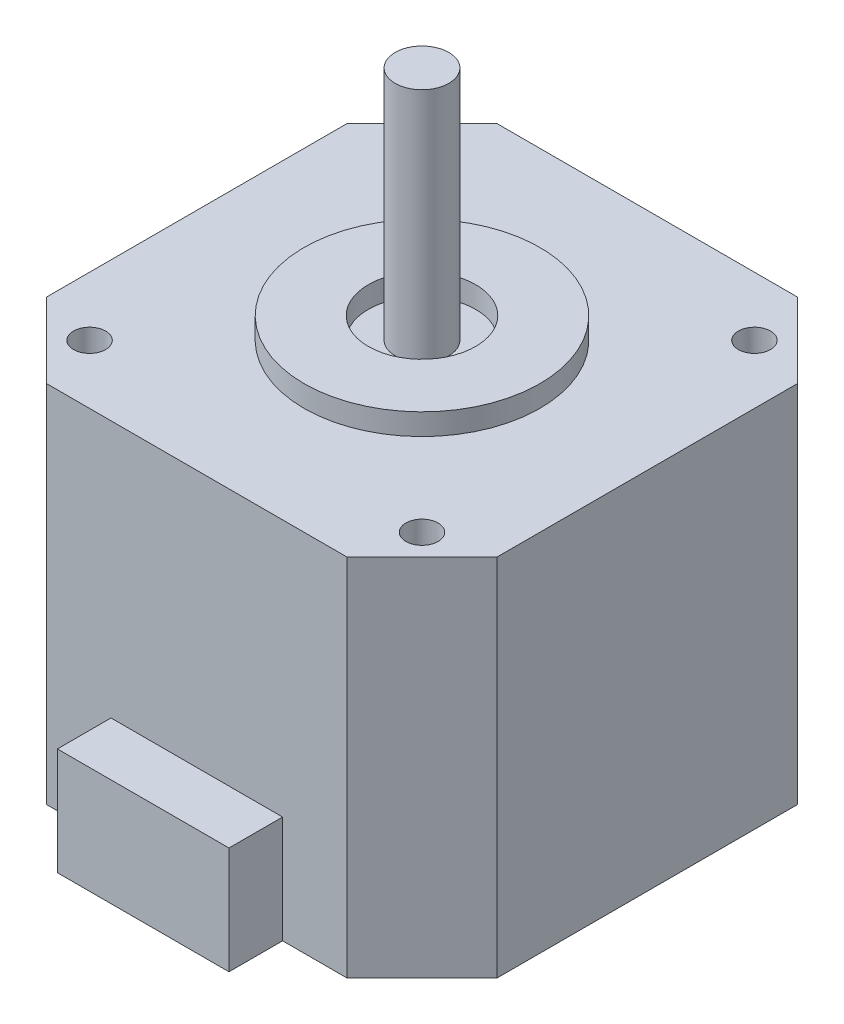
ISO-10303-21;
HEADER;
FILE_DESCRIPTION(('STEP AP214'),'2;1');
FILE_NAME('part.step','',(''),(''),'','','');
FILE_SCHEMA(('AUTOMOTIVE_DESIGN { 1 0 10303 214 1 1 1 1 }'));
ENDSEC;
DATA;
#1=APPLICATION_CONTEXT('core data for automotive mechanical design processes');
#2=APPLICATION_PROTOCOL_DEFINITION('international standard','automotive_design',2000,#1);
#3=PRODUCT_CONTEXT('',#1,'mechanical');
#4=PRODUCT('Part','Part','',(#3));
#5=PRODUCT_RELATED_PRODUCT_CATEGORY('part','',(#4));
#6=PRODUCT_DEFINITION_FORMATION('','',#4);
#7=PRODUCT_DEFINITION_CONTEXT('part definition',#1,'design');
#8=PRODUCT_DEFINITION('design','',#6,#7);
#9=PRODUCT_DEFINITION_SHAPE('','',#8);
#10=(LENGTH_UNIT() NAMED_UNIT(*) SI_UNIT(.MILLI.,.METRE.));
#11=(NAMED_UNIT(*) PLANE_ANGLE_UNIT() SI_UNIT($,.RADIAN.));
#12=(NAMED_UNIT(*) SI_UNIT($,.STERADIAN.) SOLID_ANGLE_UNIT());
#13=UNCERTAINTY_MEASURE_WITH_UNIT(LENGTH_MEASURE(1.E-05),#10,'distance_accuracy_value','');
#14=(GEOMETRIC_REPRESENTATION_CONTEXT(3) GLOBAL_UNCERTAINTY_ASSIGNED_CONTEXT((#13)) GLOBAL_UNIT_ASSIGNED_CONTEXT((#10,
#11,#12)) REPRESENTATION_CONTEXT('',''));
#15=CARTESIAN_POINT('',(0.,0.,0.));
#16=DIRECTION('',(0.,0.,1.));
#17=DIRECTION('',(1.,0.,0.));
#18=AXIS2_PLACEMENT_3D('',#15,#16,#17);
#19=CARTESIAN_POINT('',(0.,34.,0.));
#20=DIRECTION('',(0.,0.,-1.));
#21=DIRECTION('',(-1.,0.,0.));
#22=AXIS2_PLACEMENT_3D('',#19,#20,#21);
#23=PLANE('',#22);
#24=DIRECTION('',(0.,-1.,0.));
#25=VECTOR('',#24,1.);
#26=CARTESIAN_POINT('',(13.,0.,0.));
#27=LINE('',#26,#25);
#28=CARTESIAN_POINT('',(13.,10.,0.));
#29=VERTEX_POINT('',#28);
#30=CARTESIAN_POINT('',(13.,0.,0.));
#31=VERTEX_POINT('',#30);
#32=EDGE_CURVE('E55',#29,#31,#27,.T.);
#33=ORIENTED_EDGE('',*,*,#32,.F.);
#34=DIRECTION('',(-1.,0.,0.));
#35=VECTOR('',#34,1.);
#36=CARTESIAN_POINT('',(13.,10.,0.));
#37=LINE('',#36,#35);
#38=CARTESIAN_POINT('',(29.,10.,0.));
#39=VERTEX_POINT('',#38);
#40=EDGE_CURVE('E149',#39,#29,#37,.T.);
#41=ORIENTED_EDGE('',*,*,#40,.F.);
#42=DIRECTION('',(0.,1.,0.));
#43=VECTOR('',#42,1.);
#44=CARTESIAN_POINT('',(29.,0.,0.));
#45=LINE('',#44,#43);
#46=CARTESIAN_POINT('',(29.,0.,0.));
#47=VERTEX_POINT('',#46);
#48=EDGE_CURVE('E61',#47,#39,#45,.T.);
#49=ORIENTED_EDGE('',*,*,#48,.F.);
#50=DIRECTION('',(1.,0.,0.));
#51=VECTOR('',#50,1.);
#52=CARTESIAN_POINT('',(0.,0.,0.));
#53=LINE('',#52,#51);
#54=CARTESIAN_POINT('',(35.,0.,0.));
#55=VERTEX_POINT('',#54);
#56=EDGE_CURVE('E199',#47,#55,#53,.T.);
#57=ORIENTED_EDGE('',*,*,#56,.T.);
#58=DIRECTION('',(0.,-1.,0.));
#59=VECTOR('',#58,1.);
#60=CARTESIAN_POINT('',(35.,34.,0.));
#61=LINE('',#60,#59);
#62=CARTESIAN_POINT('',(35.,34.,0.));
#63=VERTEX_POINT('',#62);
#64=EDGE_CURVE('E181',#63,#55,#61,.T.);
#65=ORIENTED_EDGE('',*,*,#64,.F.);
#66=DIRECTION('',(1.,0.,0.));
#67=VECTOR('',#66,1.);
#68=CARTESIAN_POINT('',(0.,34.,0.));
#69=LINE('',#68,#67);
#70=CARTESIAN_POINT('',(7.,34.,0.));
#71=VERTEX_POINT('',#70);
#72=EDGE_CURVE('E180',#71,#63,#69,.T.);
#73=ORIENTED_EDGE('',*,*,#72,.F.);
#74=DIRECTION('',(0.,-1.,0.));
#75=VECTOR('',#74,1.);
#76=CARTESIAN_POINT('',(7.,34.,0.));
#77=LINE('',#76,#75);
#78=CARTESIAN_POINT('',(7.,0.,0.));
#79=VERTEX_POINT('',#78);
#80=EDGE_CURVE('E203',#71,#79,#77,.T.);
#81=ORIENTED_EDGE('',*,*,#80,.T.);
#82=EDGE_CURVE('E164',#79,#31,#53,.T.);
#83=ORIENTED_EDGE('',*,*,#82,.T.);
#84=EDGE_LOOP('',(#33,#41,#49,#57,#65,#73,#81,#83));
#85=FACE_BOUND('',#84,.T.);
#86=ADVANCED_FACE('F40',(#85),#23,.F.);
#87=CARTESIAN_POINT('',(17.5,34.,17.5));
#88=DIRECTION('',(0.707106781186548,0.,0.707106781186547));
#89=DIRECTION('',(0.707106781186547,0.,-0.707106781186548));
#90=AXIS2_PLACEMENT_3D('',#87,#88,#89);
#91=PLANE('',#90);
#92=DIRECTION('',(-0.707106781186547,0.,0.707106781186548));
#93=VECTOR('',#92,1.);
#94=CARTESIAN_POINT('',(17.5,0.,17.5));
#95=LINE('',#94,#93);
#96=CARTESIAN_POINT('',(42.,0.,-7.));
#97=VERTEX_POINT('',#96);
#98=EDGE_CURVE('E152',#97,#55,#95,.T.);
#99=ORIENTED_EDGE('',*,*,#98,.F.);
#100=DIRECTION('',(0.,-1.,0.));
#101=VECTOR('',#100,1.);
#102=CARTESIAN_POINT('',(42.,34.,-7.));
#103=LINE('',#102,#101);
#104=CARTESIAN_POINT('',(42.,34.,-7.));
#105=VERTEX_POINT('',#104);
#106=EDGE_CURVE('E48',#105,#97,#103,.T.);
#107=ORIENTED_EDGE('',*,*,#106,.F.);
#108=DIRECTION('',(-0.707106781186547,0.,0.707106781186548));
#109=VECTOR('',#108,1.);
#110=CARTESIAN_POINT('',(17.5,34.,17.5));
#111=LINE('',#110,#109);
#112=EDGE_CURVE('E160',#105,#63,#111,.T.);
#113=ORIENTED_EDGE('',*,*,#112,.T.);
#114=ORIENTED_EDGE('',*,*,#64,.T.);
#115=EDGE_LOOP('',(#99,#107,#113,#114));
#116=FACE_BOUND('',#115,.T.);
#117=ADVANCED_FACE('F42',(#116),#91,.T.);
#118=CARTESIAN_POINT('',(42.,34.,0.));
#119=DIRECTION('',(-1.,0.,0.));
#120=DIRECTION('',(0.,0.,1.));
#121=AXIS2_PLACEMENT_3D('',#118,#119,#120);
#122=PLANE('',#121);
#123=DIRECTION('',(0.,0.,-1.));
#124=VECTOR('',#123,1.);
#125=CARTESIAN_POINT('',(42.,0.,0.));
#126=LINE('',#125,#124);
#127=CARTESIAN_POINT('',(42.,0.,-35.));
#128=VERTEX_POINT('',#127);
#129=EDGE_CURVE('E154',#97,#128,#126,.T.);
#130=ORIENTED_EDGE('',*,*,#129,.T.);
#131=DIRECTION('',(0.,-1.,0.));
#132=VECTOR('',#131,1.);
#133=CARTESIAN_POINT('',(42.,34.,-35.));
#134=LINE('',#133,#132);
#135=CARTESIAN_POINT('',(42.,34.,-35.));
#136=VERTEX_POINT('',#135);
#137=EDGE_CURVE('E214',#136,#128,#134,.T.);
#138=ORIENTED_EDGE('',*,*,#137,.F.);
#139=DIRECTION('',(0.,0.,-1.));
#140=VECTOR('',#139,1.);
#141=CARTESIAN_POINT('',(42.,34.,0.));
#142=LINE('',#141,#140);
#143=EDGE_CURVE('E163',#105,#136,#142,.T.);
#144=ORIENTED_EDGE('',*,*,#143,.F.);
#145=ORIENTED_EDGE('',*,*,#106,.T.);
#146=EDGE_LOOP('',(#130,#138,#144,#145));
#147=FACE_BOUND('',#146,.T.);
#148=ADVANCED_FACE('F218',(#147),#122,.F.);
#149=CARTESIAN_POINT('',(38.5,34.,-38.5));
#150=DIRECTION('',(0.707106781186547,0.,-0.707106781186547));
#151=DIRECTION('',(-0.707106781186548,0.,-0.707106781186548));
#152=AXIS2_PLACEMENT_3D('',#149,#150,#151);
#153=PLANE('',#152);
#154=DIRECTION('',(0.707106781186548,0.,0.707106781186548));
#155=VECTOR('',#154,1.);
#156=CARTESIAN_POINT('',(38.5,0.,-38.5));
#157=LINE('',#156,#155);
#158=CARTESIAN_POINT('',(35.,0.,-42.));
#159=VERTEX_POINT('',#158);
#160=EDGE_CURVE('E185',#159,#128,#157,.T.);
#161=ORIENTED_EDGE('',*,*,#160,.F.);
#162=DIRECTION('',(0.,-1.,0.));
#163=VECTOR('',#162,1.);
#164=CARTESIAN_POINT('',(35.,34.,-42.));
#165=LINE('',#164,#163);
#166=CARTESIAN_POINT('',(35.,34.,-42.));
#167=VERTEX_POINT('',#166);
#168=EDGE_CURVE('E212',#167,#159,#165,.T.);
#169=ORIENTED_EDGE('',*,*,#168,.F.);
#170=DIRECTION('',(0.707106781186548,0.,0.707106781186548));
#171=VECTOR('',#170,1.);
#172=CARTESIAN_POINT('',(38.5,34.,-38.5));
#173=LINE('',#172,#171);
#174=EDGE_CURVE('E166',#167,#136,#173,.T.);
#175=ORIENTED_EDGE('',*,*,#174,.T.);
#176=ORIENTED_EDGE('',*,*,#137,.T.);
#177=EDGE_LOOP('',(#161,#169,#175,#176));
#178=FACE_BOUND('',#177,.T.);
#179=ADVANCED_FACE('F273',(#178),#153,.T.);
#180=CARTESIAN_POINT('',(0.,34.,-42.));
#181=DIRECTION('',(0.,0.,-1.));
#182=DIRECTION('',(-1.,0.,0.));
#183=AXIS2_PLACEMENT_3D('',#180,#181,#182);
#184=PLANE('',#183);
#185=DIRECTION('',(1.,0.,0.));
#186=VECTOR('',#185,1.);
#187=CARTESIAN_POINT('',(0.,0.,-42.));
#188=LINE('',#187,#186);
#189=CARTESIAN_POINT('',(7.,0.,-42.));
#190=VERTEX_POINT('',#189);
#191=EDGE_CURVE('E188',#190,#159,#188,.T.);
#192=ORIENTED_EDGE('',*,*,#191,.F.);
#193=DIRECTION('',(0.,-1.,0.));
#194=VECTOR('',#193,1.);
#195=CARTESIAN_POINT('',(7.,34.,-42.));
#196=LINE('',#195,#194);
#197=CARTESIAN_POINT('',(7.,34.,-42.));
#198=VERTEX_POINT('',#197);
#199=EDGE_CURVE('E210',#198,#190,#196,.T.);
#200=ORIENTED_EDGE('',*,*,#199,.F.);
#201=DIRECTION('',(1.,0.,0.));
#202=VECTOR('',#201,1.);
#203=CARTESIAN_POINT('',(0.,34.,-42.));
#204=LINE('',#203,#202);
#205=EDGE_CURVE('E169',#198,#167,#204,.T.);
#206=ORIENTED_EDGE('',*,*,#205,.T.);
#207=ORIENTED_EDGE('',*,*,#168,.T.);
#208=EDGE_LOOP('',(#192,#200,#206,#207));
#209=FACE_BOUND('',#208,.T.);
#210=ADVANCED_FACE('F269',(#209),#184,.T.);
#211=CARTESIAN_POINT('',(-17.5,34.,-17.5));
#212=DIRECTION('',(-0.707106781186547,0.,-0.707106781186547));
#213=DIRECTION('',(-0.707106781186548,0.,0.707106781186548));
#214=AXIS2_PLACEMENT_3D('',#211,#212,#213);
#215=PLANE('',#214);
#216=DIRECTION('',(0.707106781186548,0.,-0.707106781186548));
#217=VECTOR('',#216,1.);
#218=CARTESIAN_POINT('',(-17.5,0.,-17.5));
#219=LINE('',#218,#217);
#220=CARTESIAN_POINT('',(0.,0.,-35.));
#221=VERTEX_POINT('',#220);
#222=EDGE_CURVE('E191',#221,#190,#219,.T.);
#223=ORIENTED_EDGE('',*,*,#222,.F.);
#224=DIRECTION('',(0.,-1.,0.));
#225=VECTOR('',#224,1.);
#226=CARTESIAN_POINT('',(0.,34.,-35.));
#227=LINE('',#226,#225);
#228=CARTESIAN_POINT('',(0.,34.,-35.));
#229=VERTEX_POINT('',#228);
#230=EDGE_CURVE('E208',#229,#221,#227,.T.);
#231=ORIENTED_EDGE('',*,*,#230,.F.);
#232=DIRECTION('',(0.707106781186548,0.,-0.707106781186548));
#233=VECTOR('',#232,1.);
#234=CARTESIAN_POINT('',(-17.5,34.,-17.5));
#235=LINE('',#234,#233);
#236=EDGE_CURVE('E172',#229,#198,#235,.T.);
#237=ORIENTED_EDGE('',*,*,#236,.T.);
#238=ORIENTED_EDGE('',*,*,#199,.T.);
#239=EDGE_LOOP('',(#223,#231,#237,#238));
#240=FACE_BOUND('',#239,.T.);
#241=ADVANCED_FACE('F265',(#240),#215,.T.);
#242=CARTESIAN_POINT('',(0.,34.,0.));
#243=DIRECTION('',(-1.,0.,0.));
#244=DIRECTION('',(0.,0.,1.));
#245=AXIS2_PLACEMENT_3D('',#242,#243,#244);
#246=PLANE('',#245);
#247=DIRECTION('',(0.,0.,-1.));
#248=VECTOR('',#247,1.);
#249=CARTESIAN_POINT('',(0.,0.,0.));
#250=LINE('',#249,#248);
#251=CARTESIAN_POINT('',(0.,0.,-7.));
#252=VERTEX_POINT('',#251);
#253=EDGE_CURVE('E194',#252,#221,#250,.T.);
#254=ORIENTED_EDGE('',*,*,#253,.F.);
#255=DIRECTION('',(0.,-1.,0.));
#256=VECTOR('',#255,1.);
#257=CARTESIAN_POINT('',(0.,34.,-7.));
#258=LINE('',#257,#256);
#259=CARTESIAN_POINT('',(0.,34.,-7.));
#260=VERTEX_POINT('',#259);
#261=EDGE_CURVE('E206',#260,#252,#258,.T.);
#262=ORIENTED_EDGE('',*,*,#261,.F.);
#263=DIRECTION('',(0.,0.,-1.));
#264=VECTOR('',#263,1.);
#265=CARTESIAN_POINT('',(0.,34.,0.));
#266=LINE('',#265,#264);
#267=EDGE_CURVE('E175',#260,#229,#266,.T.);
#268=ORIENTED_EDGE('',*,*,#267,.T.);
#269=ORIENTED_EDGE('',*,*,#230,.T.);
#270=EDGE_LOOP('',(#254,#262,#268,#269));
#271=FACE_BOUND('',#270,.T.);
#272=ADVANCED_FACE('F261',(#271),#246,.T.);
#273=CARTESIAN_POINT('',(3.5,34.,-3.5));
#274=DIRECTION('',(0.707106781186547,0.,-0.707106781186547));
#275=DIRECTION('',(-0.707106781186548,0.,-0.707106781186548));
#276=AXIS2_PLACEMENT_3D('',#273,#274,#275);
#277=PLANE('',#276);
#278=DIRECTION('',(0.707106781186548,0.,0.707106781186548));
#279=VECTOR('',#278,1.);
#280=CARTESIAN_POINT('',(3.5,0.,-3.5));
#281=LINE('',#280,#279);
#282=EDGE_CURVE('E197',#252,#79,#281,.T.);
#283=ORIENTED_EDGE('',*,*,#282,.T.);
#284=ORIENTED_EDGE('',*,*,#80,.F.);
#285=DIRECTION('',(0.707106781186548,0.,0.707106781186548));
#286=VECTOR('',#285,1.);
#287=CARTESIAN_POINT('',(3.5,34.,-3.5));
#288=LINE('',#287,#286);
#289=EDGE_CURVE('E178',#260,#71,#288,.T.);
#290=ORIENTED_EDGE('',*,*,#289,.F.);
#291=ORIENTED_EDGE('',*,*,#261,.T.);
#292=EDGE_LOOP('',(#283,#284,#290,#291));
#293=FACE_BOUND('',#292,.T.);
#294=ADVANCED_FACE('F257',(#293),#277,.F.);
#295=CARTESIAN_POINT('',(0.,34.,0.));
#296=DIRECTION('',(0.,1.,0.));
#297=DIRECTION('',(0.,0.,1.));
#298=AXIS2_PLACEMENT_3D('',#295,#296,#297);
#299=PLANE('',#298);
#300=CARTESIAN_POINT('',(36.5,34.,-36.5));
#301=DIRECTION('',(0.,1.,0.));
#302=DIRECTION('',(0.,0.,1.));
#303=AXIS2_PLACEMENT_3D('',#300,#301,#302);
#304=CIRCLE('',#303,1.5);
#305=CARTESIAN_POINT('',(36.5,34.,-35.));
#306=VERTEX_POINT('',#305);
#307=EDGE_CURVE('E619',#306,#306,#304,.T.);
#308=ORIENTED_EDGE('',*,*,#307,.F.);
#309=EDGE_LOOP('',(#308));
#310=FACE_BOUND('',#309,.T.);
#311=CARTESIAN_POINT('',(36.5,34.,-5.5));
#312=DIRECTION('',(0.,1.,0.));
#313=DIRECTION('',(0.,0.,1.));
#314=AXIS2_PLACEMENT_3D('',#311,#312,#313);
#315=CIRCLE('',#314,1.5);
#316=CARTESIAN_POINT('',(36.5,34.,-4.));
#317=VERTEX_POINT('',#316);
#318=EDGE_CURVE('E677',#317,#317,#315,.T.);
#319=ORIENTED_EDGE('',*,*,#318,.F.);
#320=EDGE_LOOP('',(#319));
#321=FACE_BOUND('',#320,.T.);
#322=CARTESIAN_POINT('',(5.50000000000001,34.,-5.5));
#323=DIRECTION('',(0.,1.,0.));
#324=DIRECTION('',(0.,0.,1.));
#325=AXIS2_PLACEMENT_3D('',#322,#323,#324);
#326=CIRCLE('',#325,1.5);
#327=CARTESIAN_POINT('',(5.50000000000001,34.,-4.));
#328=VERTEX_POINT('',#327);
#329=EDGE_CURVE('E633',#328,#328,#326,.T.);
#330=ORIENTED_EDGE('',*,*,#329,.F.);
#331=EDGE_LOOP('',(#330));
#332=FACE_BOUND('',#331,.T.);
#333=CARTESIAN_POINT('',(5.5,34.,-36.5));
#334=DIRECTION('',(0.,1.,0.));
#335=DIRECTION('',(0.,0.,1.));
#336=AXIS2_PLACEMENT_3D('',#333,#334,#335);
#337=CIRCLE('',#336,1.5);
#338=CARTESIAN_POINT('',(5.5,34.,-35.));
#339=VERTEX_POINT('',#338);
#340=EDGE_CURVE('E630',#339,#339,#337,.T.);
#341=ORIENTED_EDGE('',*,*,#340,.F.);
#342=EDGE_LOOP('',(#341));
#343=FACE_BOUND('',#342,.T.);
#344=CARTESIAN_POINT('',(21.,34.,-21.));
#345=DIRECTION('',(0.,1.,0.));
#346=DIRECTION('',(0.,0.,1.));
#347=AXIS2_PLACEMENT_3D('',#344,#345,#346);
#348=CIRCLE('',#347,11.);
#349=CARTESIAN_POINT('',(21.,34.,-10.));
#350=VERTEX_POINT('',#349);
#351=EDGE_CURVE('E642',#350,#350,#348,.T.);
#352=ORIENTED_EDGE('',*,*,#351,.F.);
#353=EDGE_LOOP('',(#352));
#354=FACE_BOUND('',#353,.T.);
#355=ORIENTED_EDGE('',*,*,#112,.F.);
#356=ORIENTED_EDGE('',*,*,#143,.T.);
#357=ORIENTED_EDGE('',*,*,#174,.F.);
#358=ORIENTED_EDGE('',*,*,#205,.F.);
#359=ORIENTED_EDGE('',*,*,#236,.F.);
#360=ORIENTED_EDGE('',*,*,#267,.F.);
#361=ORIENTED_EDGE('',*,*,#289,.T.);
#362=ORIENTED_EDGE('',*,*,#72,.T.);
#363=EDGE_LOOP('',(#355,#356,#357,#358,#359,#360,#361,#362));
#364=FACE_BOUND('',#363,.T.);
#365=ADVANCED_FACE('F260',(#310,#321,#332,#343,#354,#364),#299,.T.);
#366=CARTESIAN_POINT('',(0.,0.,0.));
#367=DIRECTION('',(0.,1.,0.));
#368=DIRECTION('',(0.,0.,1.));
#369=AXIS2_PLACEMENT_3D('',#366,#367,#368);
#370=PLANE('',#369);
#371=ORIENTED_EDGE('',*,*,#98,.T.);
#372=ORIENTED_EDGE('',*,*,#56,.F.);
#373=DIRECTION('',(0.,0.,-1.));
#374=VECTOR('',#373,1.);
#375=CARTESIAN_POINT('',(29.,0.,5.));
#376=LINE('',#375,#374);
#377=CARTESIAN_POINT('',(29.,0.,5.));
#378=VERTEX_POINT('',#377);
#379=EDGE_CURVE('E136',#378,#47,#376,.T.);
#380=ORIENTED_EDGE('',*,*,#379,.F.);
#381=DIRECTION('',(1.,0.,0.));
#382=VECTOR('',#381,1.);
#383=CARTESIAN_POINT('',(13.,0.,5.));
#384=LINE('',#383,#382);
#385=CARTESIAN_POINT('',(13.,0.,5.));
#386=VERTEX_POINT('',#385);
#387=EDGE_CURVE('E128',#386,#378,#384,.T.);
#388=ORIENTED_EDGE('',*,*,#387,.F.);
#389=DIRECTION('',(0.,0.,-1.));
#390=VECTOR('',#389,1.);
#391=CARTESIAN_POINT('',(13.,0.,5.));
#392=LINE('',#391,#390);
#393=EDGE_CURVE('E134',#386,#31,#392,.T.);
#394=ORIENTED_EDGE('',*,*,#393,.T.);
#395=ORIENTED_EDGE('',*,*,#82,.F.);
#396=ORIENTED_EDGE('',*,*,#282,.F.);
#397=ORIENTED_EDGE('',*,*,#253,.T.);
#398=ORIENTED_EDGE('',*,*,#222,.T.);
#399=ORIENTED_EDGE('',*,*,#191,.T.);
#400=ORIENTED_EDGE('',*,*,#160,.T.);
#401=ORIENTED_EDGE('',*,*,#129,.F.);
#402=EDGE_LOOP('',(#371,#372,#380,#388,#394,#395,#396,#397,#398,#399,#400,#401));
#403=FACE_BOUND('',#402,.T.);
#404=ADVANCED_FACE('F131',(#403),#370,.F.);
#405=CARTESIAN_POINT('',(13.,0.,5.));
#406=DIRECTION('',(1.,0.,0.));
#407=DIRECTION('',(0.,0.,-1.));
#408=AXIS2_PLACEMENT_3D('',#405,#406,#407);
#409=PLANE('',#408);
#410=ORIENTED_EDGE('',*,*,#32,.T.);
#411=ORIENTED_EDGE('',*,*,#393,.F.);
#412=DIRECTION('',(0.,-1.,0.));
#413=VECTOR('',#412,1.);
#414=CARTESIAN_POINT('',(13.,0.,5.));
#415=LINE('',#414,#413);
#416=CARTESIAN_POINT('',(13.,10.,5.));
#417=VERTEX_POINT('',#416);
#418=EDGE_CURVE('E140',#417,#386,#415,.T.);
#419=ORIENTED_EDGE('',*,*,#418,.F.);
#420=DIRECTION('',(0.,0.,-1.));
#421=VECTOR('',#420,1.);
#422=CARTESIAN_POINT('',(13.,10.,5.));
#423=LINE('',#422,#421);
#424=EDGE_CURVE('E231',#417,#29,#423,.T.);
#425=ORIENTED_EDGE('',*,*,#424,.T.);
#426=EDGE_LOOP('',(#410,#411,#419,#425));
#427=FACE_BOUND('',#426,.T.);
#428=ADVANCED_FACE('F151',(#427),#409,.F.);
#429=CARTESIAN_POINT('',(29.,0.,5.));
#430=DIRECTION('',(-1.,0.,0.));
#431=DIRECTION('',(0.,0.,1.));
#432=AXIS2_PLACEMENT_3D('',#429,#430,#431);
#433=PLANE('',#432);
#434=ORIENTED_EDGE('',*,*,#48,.T.);
#435=DIRECTION('',(0.,0.,-1.));
#436=VECTOR('',#435,1.);
#437=CARTESIAN_POINT('',(29.,10.,5.));
#438=LINE('',#437,#436);
#439=CARTESIAN_POINT('',(29.,10.,5.));
#440=VERTEX_POINT('',#439);
#441=EDGE_CURVE('E156',#440,#39,#438,.T.);
#442=ORIENTED_EDGE('',*,*,#441,.F.);
#443=DIRECTION('',(0.,1.,0.));
#444=VECTOR('',#443,1.);
#445=CARTESIAN_POINT('',(29.,0.,5.));
#446=LINE('',#445,#444);
#447=EDGE_CURVE('E139',#378,#440,#446,.T.);
#448=ORIENTED_EDGE('',*,*,#447,.F.);
#449=ORIENTED_EDGE('',*,*,#379,.T.);
#450=EDGE_LOOP('',(#434,#442,#448,#449));
#451=FACE_BOUND('',#450,.T.);
#452=ADVANCED_FACE('F227',(#451),#433,.F.);
#453=CARTESIAN_POINT('',(13.,10.,5.));
#454=DIRECTION('',(0.,-1.,0.));
#455=DIRECTION('',(0.,0.,-1.));
#456=AXIS2_PLACEMENT_3D('',#453,#454,#455);
#457=PLANE('',#456);
#458=ORIENTED_EDGE('',*,*,#40,.T.);
#459=ORIENTED_EDGE('',*,*,#424,.F.);
#460=DIRECTION('',(-1.,0.,0.));
#461=VECTOR('',#460,1.);
#462=CARTESIAN_POINT('',(13.,10.,5.));
#463=LINE('',#462,#461);
#464=EDGE_CURVE('E145',#440,#417,#463,.T.);
#465=ORIENTED_EDGE('',*,*,#464,.F.);
#466=ORIENTED_EDGE('',*,*,#441,.T.);
#467=EDGE_LOOP('',(#458,#459,#465,#466));
#468=FACE_BOUND('',#467,.T.);
#469=ADVANCED_FACE('F239',(#468),#457,.F.);
#470=CARTESIAN_POINT('',(0.,0.,5.));
#471=DIRECTION('',(0.,0.,-1.));
#472=DIRECTION('',(-1.,0.,0.));
#473=AXIS2_PLACEMENT_3D('',#470,#471,#472);
#474=PLANE('',#473);
#475=ORIENTED_EDGE('',*,*,#418,.T.);
#476=ORIENTED_EDGE('',*,*,#387,.T.);
#477=ORIENTED_EDGE('',*,*,#447,.T.);
#478=ORIENTED_EDGE('',*,*,#464,.T.);
#479=EDGE_LOOP('',(#475,#476,#477,#478));
#480=FACE_BOUND('',#479,.T.);
#481=ADVANCED_FACE('F143',(#480),#474,.F.);
#482=CARTESIAN_POINT('',(21.,36.,-21.));
#483=DIRECTION('',(0.,1.,0.));
#484=DIRECTION('',(0.,0.,1.));
#485=AXIS2_PLACEMENT_3D('',#482,#483,#484);
#486=PLANE('',#485);
#487=CARTESIAN_POINT('',(21.,36.,-21.));
#488=DIRECTION('',(0.,1.,0.));
#489=DIRECTION('',(0.,0.,1.));
#490=AXIS2_PLACEMENT_3D('',#487,#488,#489);
#491=CIRCLE('',#490,11.);
#492=CARTESIAN_POINT('',(21.,36.,-10.));
#493=VERTEX_POINT('',#492);
#494=EDGE_CURVE('E235',#493,#493,#491,.T.);
#495=ORIENTED_EDGE('',*,*,#494,.T.);
#496=EDGE_LOOP('',(#495));
#497=FACE_BOUND('',#496,.T.);
#498=CARTESIAN_POINT('',(21.,36.,-21.));
#499=DIRECTION('',(0.,1.,0.));
#500=DIRECTION('',(0.,0.,1.));
#501=AXIS2_PLACEMENT_3D('',#498,#499,#500);
#502=CIRCLE('',#501,5.);
#503=CARTESIAN_POINT('',(21.,36.,-16.));
#504=VERTEX_POINT('',#503);
#505=EDGE_CURVE('E637',#504,#504,#502,.T.);
#506=ORIENTED_EDGE('',*,*,#505,.F.);
#507=EDGE_LOOP('',(#506));
#508=FACE_BOUND('',#507,.T.);
#509=ADVANCED_FACE('F246',(#497,#508),#486,.T.);
#510=CARTESIAN_POINT('',(21.,36.,-21.));
#511=DIRECTION('',(0.,-1.,0.));
#512=DIRECTION('',(0.,0.,-1.));
#513=AXIS2_PLACEMENT_3D('',#510,#511,#512);
#514=CYLINDRICAL_SURFACE('',#513,11.);
#515=ORIENTED_EDGE('',*,*,#494,.F.);
#516=EDGE_LOOP('',(#515));
#517=FACE_BOUND('',#516,.T.);
#518=ORIENTED_EDGE('',*,*,#351,.T.);
#519=EDGE_LOOP('',(#518));
#520=FACE_BOUND('',#519,.T.);
#521=ADVANCED_FACE('F343',(#517,#520),#514,.T.);
#522=CARTESIAN_POINT('',(21.,36.,-21.));
#523=DIRECTION('',(0.,-1.,0.));
#524=DIRECTION('',(0.,0.,-1.));
#525=AXIS2_PLACEMENT_3D('',#522,#523,#524);
#526=CYLINDRICAL_SURFACE('',#525,5.);
#527=ORIENTED_EDGE('',*,*,#505,.T.);
#528=EDGE_LOOP('',(#527));
#529=FACE_BOUND('',#528,.T.);
#530=CARTESIAN_POINT('',(21.,34.,-21.));
#531=DIRECTION('',(0.,1.,0.));
#532=DIRECTION('',(0.,0.,1.));
#533=AXIS2_PLACEMENT_3D('',#530,#531,#532);
#534=CIRCLE('',#533,5.);
#535=CARTESIAN_POINT('',(21.,34.,-16.));
#536=VERTEX_POINT('',#535);
#537=EDGE_CURVE('E11',#536,#536,#534,.F.);
#538=ORIENTED_EDGE('',*,*,#537,.T.);
#539=EDGE_LOOP('',(#538));
#540=FACE_BOUND('',#539,.T.);
#541=ADVANCED_FACE('F353',(#529,#540),#526,.F.);
#542=CARTESIAN_POINT('',(21.,34.,-21.));
#543=DIRECTION('',(0.,1.,0.));
#544=DIRECTION('',(0.,0.,1.));
#545=AXIS2_PLACEMENT_3D('',#542,#543,#544);
#546=CIRCLE('',#545,2.5);
#547=CARTESIAN_POINT('',(21.,34.,-18.5));
#548=VERTEX_POINT('',#547);
#549=EDGE_CURVE('E629',#548,#548,#546,.T.);
#550=ORIENTED_EDGE('',*,*,#549,.F.);
#551=EDGE_LOOP('',(#550));
#552=FACE_BOUND('',#551,.T.);
#553=ORIENTED_EDGE('',*,*,#537,.F.);
#554=EDGE_LOOP('',(#553));
#555=FACE_BOUND('',#554,.T.);
#556=ADVANCED_FACE('F309',(#552,#555),#299,.T.);
#557=CARTESIAN_POINT('',(21.,56.,-21.));
#558=DIRECTION('',(0.,-1.,0.));
#559=DIRECTION('',(0.,0.,-1.));
#560=AXIS2_PLACEMENT_3D('',#557,#558,#559);
#561=CYLINDRICAL_SURFACE('',#560,2.5);
#562=CARTESIAN_POINT('',(21.,56.,-21.));
#563=DIRECTION('',(0.,1.,0.));
#564=DIRECTION('',(0.,0.,1.));
#565=AXIS2_PLACEMENT_3D('',#562,#563,#564);
#566=CIRCLE('',#565,2.5);
#567=CARTESIAN_POINT('',(21.,56.,-18.5));
#568=VERTEX_POINT('',#567);
#569=EDGE_CURVE('E634',#568,#568,#566,.T.);
#570=ORIENTED_EDGE('',*,*,#569,.F.);
#571=EDGE_LOOP('',(#570));
#572=FACE_BOUND('',#571,.T.);
#573=ORIENTED_EDGE('',*,*,#549,.T.);
#574=EDGE_LOOP('',(#573));
#575=FACE_BOUND('',#574,.T.);
#576=ADVANCED_FACE('F372',(#572,#575),#561,.T.);
#577=CARTESIAN_POINT('',(21.,56.,-21.));
#578=DIRECTION('',(0.,1.,0.));
#579=DIRECTION('',(0.,0.,1.));
#580=AXIS2_PLACEMENT_3D('',#577,#578,#579);
#581=PLANE('',#580);
#582=ORIENTED_EDGE('',*,*,#569,.T.);
#583=EDGE_LOOP('',(#582));
#584=FACE_BOUND('',#583,.T.);
#585=ADVANCED_FACE('F381',(#584),#581,.T.);
#586=CARTESIAN_POINT('',(5.5,12.,-36.5));
#587=DIRECTION('',(0.,1.,0.));
#588=DIRECTION('',(0.,0.,1.));
#589=AXIS2_PLACEMENT_3D('',#586,#587,#588);
#590=CYLINDRICAL_SURFACE('',#589,1.5);
#591=CARTESIAN_POINT('',(5.5,12.,-36.5));
#592=DIRECTION('',(0.,1.,0.));
#593=DIRECTION('',(0.,0.,1.));
#594=AXIS2_PLACEMENT_3D('',#591,#592,#593);
#595=CIRCLE('',#594,1.5);
#596=CARTESIAN_POINT('',(5.5,12.,-35.));
#597=VERTEX_POINT('',#596);
#598=EDGE_CURVE('E626',#597,#597,#595,.T.);
#599=ORIENTED_EDGE('',*,*,#598,.F.);
#600=EDGE_LOOP('',(#599));
#601=FACE_BOUND('',#600,.T.);
#602=ORIENTED_EDGE('',*,*,#340,.T.);
#603=EDGE_LOOP('',(#602));
#604=FACE_BOUND('',#603,.T.);
#605=ADVANCED_FACE('F391',(#601,#604),#590,.F.);
#606=CARTESIAN_POINT('',(5.5,12.,-36.5));
#607=DIRECTION('',(0.,1.,0.));
#608=DIRECTION('',(0.,0.,1.));
#609=AXIS2_PLACEMENT_3D('',#606,#607,#608);
#610=PLANE('',#609);
#611=ORIENTED_EDGE('',*,*,#598,.T.);
#612=EDGE_LOOP('',(#611));
#613=FACE_BOUND('',#612,.T.);
#614=ADVANCED_FACE('F401',(#613),#610,.T.);
#615=CARTESIAN_POINT('',(5.50000000000001,12.,-5.5));
#616=DIRECTION('',(0.,1.,0.));
#617=DIRECTION('',(0.,0.,1.));
#618=AXIS2_PLACEMENT_3D('',#615,#616,#617);
#619=CYLINDRICAL_SURFACE('',#618,1.5);
#620=CARTESIAN_POINT('',(5.50000000000001,12.,-5.5));
#621=DIRECTION('',(0.,1.,0.));
#622=DIRECTION('',(0.,0.,1.));
#623=AXIS2_PLACEMENT_3D('',#620,#621,#622);
#624=CIRCLE('',#623,1.5);
#625=CARTESIAN_POINT('',(5.50000000000001,12.,-4.));
#626=VERTEX_POINT('',#625);
#627=EDGE_CURVE('E672',#626,#626,#624,.T.);
#628=ORIENTED_EDGE('',*,*,#627,.F.);
#629=EDGE_LOOP('',(#628));
#630=FACE_BOUND('',#629,.T.);
#631=ORIENTED_EDGE('',*,*,#329,.T.);
#632=EDGE_LOOP('',(#631));
#633=FACE_BOUND('',#632,.T.);
#634=ADVANCED_FACE('F411',(#630,#633),#619,.F.);
#635=CARTESIAN_POINT('',(5.50000000000001,12.,-5.5));
#636=DIRECTION('',(0.,1.,0.));
#637=DIRECTION('',(0.,0.,1.));
#638=AXIS2_PLACEMENT_3D('',#635,#636,#637);
#639=PLANE('',#638);
#640=ORIENTED_EDGE('',*,*,#627,.T.);
#641=EDGE_LOOP('',(#640));
#642=FACE_BOUND('',#641,.T.);
#643=ADVANCED_FACE('F421',(#642),#639,.T.);
#644=CARTESIAN_POINT('',(36.5,12.,-5.5));
#645=DIRECTION('',(0.,1.,0.));
#646=DIRECTION('',(0.,0.,1.));
#647=AXIS2_PLACEMENT_3D('',#644,#645,#646);
#648=CYLINDRICAL_SURFACE('',#647,1.5);
#649=CARTESIAN_POINT('',(36.5,12.,-5.5));
#650=DIRECTION('',(0.,1.,0.));
#651=DIRECTION('',(0.,0.,1.));
#652=AXIS2_PLACEMENT_3D('',#649,#650,#651);
#653=CIRCLE('',#652,1.5);
#654=CARTESIAN_POINT('',(36.5,12.,-4.));
#655=VERTEX_POINT('',#654);
#656=EDGE_CURVE('E622',#655,#655,#653,.T.);
#657=ORIENTED_EDGE('',*,*,#656,.F.);
#658=EDGE_LOOP('',(#657));
#659=FACE_BOUND('',#658,.T.);
#660=ORIENTED_EDGE('',*,*,#318,.T.);
#661=EDGE_LOOP('',(#660));
#662=FACE_BOUND('',#661,.T.);
#663=ADVANCED_FACE('F431',(#659,#662),#648,.F.);
#664=CARTESIAN_POINT('',(36.5,12.,-5.5));
#665=DIRECTION('',(0.,1.,0.));
#666=DIRECTION('',(0.,0.,1.));
#667=AXIS2_PLACEMENT_3D('',#664,#665,#666);
#668=PLANE('',#667);
#669=ORIENTED_EDGE('',*,*,#656,.T.);
#670=EDGE_LOOP('',(#669));
#671=FACE_BOUND('',#670,.T.);
#672=ADVANCED_FACE('F441',(#671),#668,.T.);
#673=CARTESIAN_POINT('',(36.5,12.,-36.5));
#674=DIRECTION('',(0.,1.,0.));
#675=DIRECTION('',(0.,0.,1.));
#676=AXIS2_PLACEMENT_3D('',#673,#674,#675);
#677=CYLINDRICAL_SURFACE('',#676,1.5);
#678=CARTESIAN_POINT('',(36.5,12.,-36.5));
#679=DIRECTION('',(0.,1.,0.));
#680=DIRECTION('',(0.,0.,1.));
#681=AXIS2_PLACEMENT_3D('',#678,#679,#680);
#682=CIRCLE('',#681,1.5);
#683=CARTESIAN_POINT('',(36.5,12.,-35.));
#684=VERTEX_POINT('',#683);
#685=EDGE_CURVE('E618',#684,#684,#682,.T.);
#686=ORIENTED_EDGE('',*,*,#685,.F.);
#687=EDGE_LOOP('',(#686));
#688=FACE_BOUND('',#687,.T.);
#689=ORIENTED_EDGE('',*,*,#307,.T.);
#690=EDGE_LOOP('',(#689));
#691=FACE_BOUND('',#690,.T.);
#692=ADVANCED_FACE('F451',(#688,#691),#677,.F.);
#693=CARTESIAN_POINT('',(36.5,12.,-36.5));
#694=DIRECTION('',(0.,1.,0.));
#695=DIRECTION('',(0.,0.,1.));
#696=AXIS2_PLACEMENT_3D('',#693,#694,#695);
#697=PLANE('',#696);
#698=ORIENTED_EDGE('',*,*,#685,.T.);
#699=EDGE_LOOP('',(#698));
#700=FACE_BOUND('',#699,.T.);
#701=ADVANCED_FACE('F461',(#700),#697,.T.);
#702=CLOSED_SHELL('',(#86,#117,#148,#179,#210,#241,#272,#294,#365,#404,#428,#452,#469,#481,#509,
#521,#541,#556,#576,#585,#605,#614,#634,#643,#663,#672,#692,#701));
#703=MANIFOLD_SOLID_BREP('B2',#702);
#704=ADVANCED_BREP_SHAPE_REPRESENTATION('',(#18,#703),#14);
#705=SHAPE_DEFINITION_REPRESENTATION(#9,#704);
ENDSEC;
END-ISO-10303-21;
